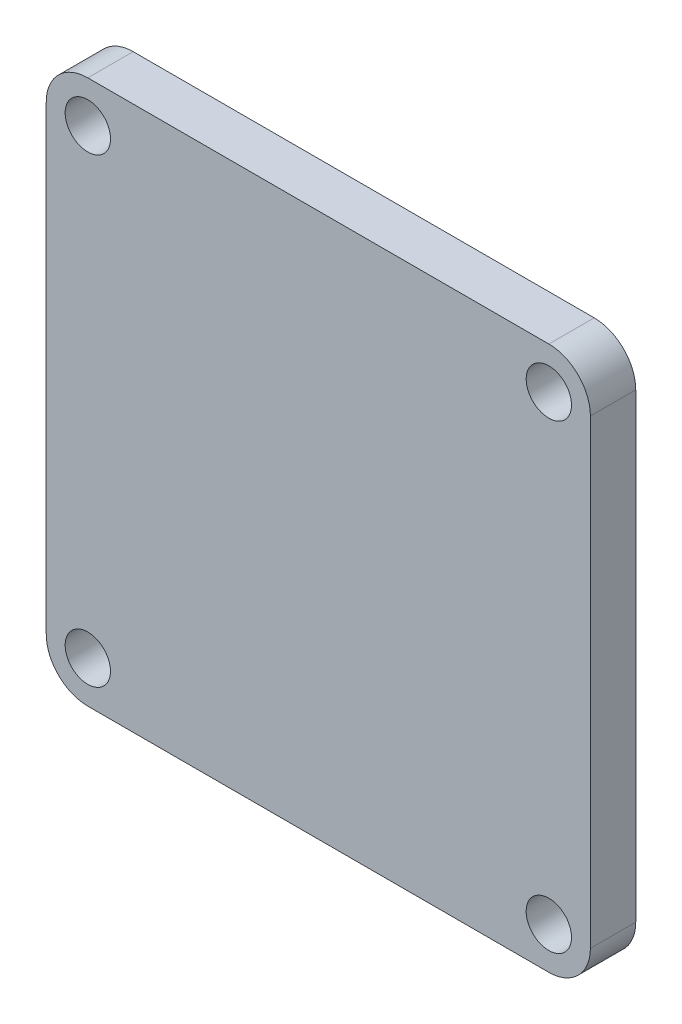
ISO-10303-21;
HEADER;
FILE_DESCRIPTION(('STEP AP214'),'2;1');
FILE_NAME('part.step','',(''),(''),'','','');
FILE_SCHEMA(('AUTOMOTIVE_DESIGN { 1 0 10303 214 1 1 1 1 }'));
ENDSEC;
DATA;
#1=APPLICATION_CONTEXT('core data for automotive mechanical design processes');
#2=APPLICATION_PROTOCOL_DEFINITION('international standard','automotive_design',2000,#1);
#3=PRODUCT_CONTEXT('',#1,'mechanical');
#4=PRODUCT('Part','Part','',(#3));
#5=PRODUCT_RELATED_PRODUCT_CATEGORY('part','',(#4));
#6=PRODUCT_DEFINITION_FORMATION('','',#4);
#7=PRODUCT_DEFINITION_CONTEXT('part definition',#1,'design');
#8=PRODUCT_DEFINITION('design','',#6,#7);
#9=PRODUCT_DEFINITION_SHAPE('','',#8);
#10=(LENGTH_UNIT() NAMED_UNIT(*) SI_UNIT(.MILLI.,.METRE.));
#11=(NAMED_UNIT(*) PLANE_ANGLE_UNIT() SI_UNIT($,.RADIAN.));
#12=(NAMED_UNIT(*) SI_UNIT($,.STERADIAN.) SOLID_ANGLE_UNIT());
#13=UNCERTAINTY_MEASURE_WITH_UNIT(LENGTH_MEASURE(1.E-05),#10,'distance_accuracy_value','');
#14=(GEOMETRIC_REPRESENTATION_CONTEXT(3) GLOBAL_UNCERTAINTY_ASSIGNED_CONTEXT((#13)) GLOBAL_UNIT_ASSIGNED_CONTEXT((#10,
#11,#12)) REPRESENTATION_CONTEXT('',''));
#15=CARTESIAN_POINT('',(0.,0.,0.));
#16=DIRECTION('',(0.,0.,1.));
#17=DIRECTION('',(1.,0.,0.));
#18=AXIS2_PLACEMENT_3D('',#15,#16,#17);
#19=CARTESIAN_POINT('',(-15.25,-15.25,3.));
#20=DIRECTION('',(0.,0.,-1.));
#21=DIRECTION('',(-1.,0.,0.));
#22=AXIS2_PLACEMENT_3D('',#19,#20,#21);
#23=PLANE('',#22);
#24=CARTESIAN_POINT('',(-15.25,-15.25,3.));
#25=DIRECTION('',(0.,0.,1.));
#26=DIRECTION('',(-1.,0.,0.));
#27=AXIS2_PLACEMENT_3D('',#24,#25,#26);
#28=CIRCLE('',#27,2.75);
#29=CARTESIAN_POINT('',(-18.,-15.25,3.));
#30=VERTEX_POINT('',#29);
#31=CARTESIAN_POINT('',(-15.25,-18.,3.));
#32=VERTEX_POINT('',#31);
#33=EDGE_CURVE('E145',#30,#32,#28,.T.);
#34=ORIENTED_EDGE('',*,*,#33,.T.);
#35=DIRECTION('',(1.,0.,0.));
#36=VECTOR('',#35,1.);
#37=CARTESIAN_POINT('',(-15.25,-18.,3.));
#38=LINE('',#37,#36);
#39=CARTESIAN_POINT('',(15.25,-18.,3.));
#40=VERTEX_POINT('',#39);
#41=EDGE_CURVE('E93',#32,#40,#38,.T.);
#42=ORIENTED_EDGE('',*,*,#41,.T.);
#43=CARTESIAN_POINT('',(15.25,-15.25,3.));
#44=DIRECTION('',(0.,0.,1.));
#45=DIRECTION('',(1.,0.,0.));
#46=AXIS2_PLACEMENT_3D('',#43,#44,#45);
#47=CIRCLE('',#46,2.75);
#48=CARTESIAN_POINT('',(18.,-15.25,3.));
#49=VERTEX_POINT('',#48);
#50=EDGE_CURVE('E160',#40,#49,#47,.T.);
#51=ORIENTED_EDGE('',*,*,#50,.T.);
#52=DIRECTION('',(0.,1.,0.));
#53=VECTOR('',#52,1.);
#54=CARTESIAN_POINT('',(18.,15.25,3.));
#55=LINE('',#54,#53);
#56=CARTESIAN_POINT('',(18.,15.25,3.));
#57=VERTEX_POINT('',#56);
#58=EDGE_CURVE('E173',#49,#57,#55,.T.);
#59=ORIENTED_EDGE('',*,*,#58,.T.);
#60=CARTESIAN_POINT('',(15.25,15.25,3.));
#61=DIRECTION('',(0.,0.,1.));
#62=DIRECTION('',(1.,0.,0.));
#63=AXIS2_PLACEMENT_3D('',#60,#61,#62);
#64=CIRCLE('',#63,2.75);
#65=CARTESIAN_POINT('',(15.25,18.,3.));
#66=VERTEX_POINT('',#65);
#67=EDGE_CURVE('E112',#57,#66,#64,.T.);
#68=ORIENTED_EDGE('',*,*,#67,.T.);
#69=DIRECTION('',(-1.,0.,0.));
#70=VECTOR('',#69,1.);
#71=CARTESIAN_POINT('',(-15.25,18.,3.));
#72=LINE('',#71,#70);
#73=CARTESIAN_POINT('',(-15.25,18.,3.));
#74=VERTEX_POINT('',#73);
#75=EDGE_CURVE('E106',#66,#74,#72,.T.);
#76=ORIENTED_EDGE('',*,*,#75,.T.);
#77=CARTESIAN_POINT('',(-15.25,15.25,3.));
#78=DIRECTION('',(0.,0.,1.));
#79=DIRECTION('',(-1.,0.,0.));
#80=AXIS2_PLACEMENT_3D('',#77,#78,#79);
#81=CIRCLE('',#80,2.75);
#82=CARTESIAN_POINT('',(-18.,15.25,3.));
#83=VERTEX_POINT('',#82);
#84=EDGE_CURVE('E110',#74,#83,#81,.T.);
#85=ORIENTED_EDGE('',*,*,#84,.T.);
#86=DIRECTION('',(0.,-1.,0.));
#87=VECTOR('',#86,1.);
#88=CARTESIAN_POINT('',(-18.,15.25,3.));
#89=LINE('',#88,#87);
#90=EDGE_CURVE('E50',#83,#30,#89,.T.);
#91=ORIENTED_EDGE('',*,*,#90,.T.);
#92=EDGE_LOOP('',(#34,#42,#51,#59,#68,#76,#85,#91));
#93=FACE_BOUND('',#92,.T.);
#94=CARTESIAN_POINT('',(-15.25,15.25,3.));
#95=DIRECTION('',(0.,0.,1.));
#96=DIRECTION('',(1.,0.,0.));
#97=AXIS2_PLACEMENT_3D('',#94,#95,#96);
#98=CIRCLE('',#97,1.5);
#99=CARTESIAN_POINT('',(-13.75,15.25,3.));
#100=VERTEX_POINT('',#99);
#101=EDGE_CURVE('E134',#100,#100,#98,.T.);
#102=ORIENTED_EDGE('',*,*,#101,.F.);
#103=EDGE_LOOP('',(#102));
#104=FACE_BOUND('',#103,.T.);
#105=CARTESIAN_POINT('',(15.25,15.25,3.));
#106=DIRECTION('',(0.,0.,1.));
#107=DIRECTION('',(-1.,0.,0.));
#108=AXIS2_PLACEMENT_3D('',#105,#106,#107);
#109=CIRCLE('',#108,1.5);
#110=CARTESIAN_POINT('',(13.75,15.25,3.));
#111=VERTEX_POINT('',#110);
#112=EDGE_CURVE('E182',#111,#111,#109,.T.);
#113=ORIENTED_EDGE('',*,*,#112,.F.);
#114=EDGE_LOOP('',(#113));
#115=FACE_BOUND('',#114,.T.);
#116=CARTESIAN_POINT('',(15.25,-15.25,3.));
#117=DIRECTION('',(0.,0.,1.));
#118=DIRECTION('',(1.,0.,0.));
#119=AXIS2_PLACEMENT_3D('',#116,#117,#118);
#120=CIRCLE('',#119,1.5);
#121=CARTESIAN_POINT('',(16.75,-15.25,3.));
#122=VERTEX_POINT('',#121);
#123=EDGE_CURVE('E188',#122,#122,#120,.T.);
#124=ORIENTED_EDGE('',*,*,#123,.F.);
#125=EDGE_LOOP('',(#124));
#126=FACE_BOUND('',#125,.T.);
#127=CARTESIAN_POINT('',(-15.25,-15.25,3.));
#128=DIRECTION('',(0.,0.,1.));
#129=DIRECTION('',(-1.,0.,0.));
#130=AXIS2_PLACEMENT_3D('',#127,#128,#129);
#131=CIRCLE('',#130,1.5);
#132=CARTESIAN_POINT('',(-16.75,-15.25,3.));
#133=VERTEX_POINT('',#132);
#134=EDGE_CURVE('E194',#133,#133,#131,.T.);
#135=ORIENTED_EDGE('',*,*,#134,.F.);
#136=EDGE_LOOP('',(#135));
#137=FACE_BOUND('',#136,.T.);
#138=ADVANCED_FACE('F33',(#93,#104,#115,#126,#137),#23,.F.);
#139=CARTESIAN_POINT('',(-15.25,-15.25,0.));
#140=DIRECTION('',(0.,0.,-1.));
#141=DIRECTION('',(-1.,0.,0.));
#142=AXIS2_PLACEMENT_3D('',#139,#140,#141);
#143=PLANE('',#142);
#144=CARTESIAN_POINT('',(15.25,-15.25,0.));
#145=DIRECTION('',(0.,0.,1.));
#146=DIRECTION('',(1.,0.,0.));
#147=AXIS2_PLACEMENT_3D('',#144,#145,#146);
#148=CIRCLE('',#147,1.5);
#149=CARTESIAN_POINT('',(16.75,-15.25,0.));
#150=VERTEX_POINT('',#149);
#151=EDGE_CURVE('E191',#150,#150,#148,.T.);
#152=ORIENTED_EDGE('',*,*,#151,.T.);
#153=EDGE_LOOP('',(#152));
#154=FACE_BOUND('',#153,.T.);
#155=CARTESIAN_POINT('',(-15.25,15.25,0.));
#156=DIRECTION('',(0.,0.,1.));
#157=DIRECTION('',(1.,0.,0.));
#158=AXIS2_PLACEMENT_3D('',#155,#156,#157);
#159=CIRCLE('',#158,1.5);
#160=CARTESIAN_POINT('',(-13.75,15.25,0.));
#161=VERTEX_POINT('',#160);
#162=EDGE_CURVE('E179',#161,#161,#159,.T.);
#163=ORIENTED_EDGE('',*,*,#162,.T.);
#164=EDGE_LOOP('',(#163));
#165=FACE_BOUND('',#164,.T.);
#166=CARTESIAN_POINT('',(-15.25,-15.25,0.));
#167=DIRECTION('',(0.,0.,1.));
#168=DIRECTION('',(-1.,0.,0.));
#169=AXIS2_PLACEMENT_3D('',#166,#167,#168);
#170=CIRCLE('',#169,2.75);
#171=CARTESIAN_POINT('',(-18.,-15.25,0.));
#172=VERTEX_POINT('',#171);
#173=CARTESIAN_POINT('',(-15.25,-18.,0.));
#174=VERTEX_POINT('',#173);
#175=EDGE_CURVE('E130',#172,#174,#170,.T.);
#176=ORIENTED_EDGE('',*,*,#175,.F.);
#177=DIRECTION('',(0.,-1.,0.));
#178=VECTOR('',#177,1.);
#179=CARTESIAN_POINT('',(-18.,15.25,0.));
#180=LINE('',#179,#178);
#181=CARTESIAN_POINT('',(-18.,15.25,0.));
#182=VERTEX_POINT('',#181);
#183=EDGE_CURVE('E85',#182,#172,#180,.T.);
#184=ORIENTED_EDGE('',*,*,#183,.F.);
#185=CARTESIAN_POINT('',(-15.25,15.25,0.));
#186=DIRECTION('',(0.,0.,1.));
#187=DIRECTION('',(-1.,0.,0.));
#188=AXIS2_PLACEMENT_3D('',#185,#186,#187);
#189=CIRCLE('',#188,2.75);
#190=CARTESIAN_POINT('',(-15.25,18.,0.));
#191=VERTEX_POINT('',#190);
#192=EDGE_CURVE('E79',#191,#182,#189,.T.);
#193=ORIENTED_EDGE('',*,*,#192,.F.);
#194=DIRECTION('',(-1.,0.,0.));
#195=VECTOR('',#194,1.);
#196=CARTESIAN_POINT('',(-15.25,18.,0.));
#197=LINE('',#196,#195);
#198=CARTESIAN_POINT('',(15.25,18.,0.));
#199=VERTEX_POINT('',#198);
#200=EDGE_CURVE('E120',#199,#191,#197,.T.);
#201=ORIENTED_EDGE('',*,*,#200,.F.);
#202=CARTESIAN_POINT('',(15.25,15.25,0.));
#203=DIRECTION('',(0.,0.,1.));
#204=DIRECTION('',(1.,0.,0.));
#205=AXIS2_PLACEMENT_3D('',#202,#203,#204);
#206=CIRCLE('',#205,2.75);
#207=CARTESIAN_POINT('',(18.,15.25,0.));
#208=VERTEX_POINT('',#207);
#209=EDGE_CURVE('E140',#208,#199,#206,.T.);
#210=ORIENTED_EDGE('',*,*,#209,.F.);
#211=DIRECTION('',(0.,1.,0.));
#212=VECTOR('',#211,1.);
#213=CARTESIAN_POINT('',(18.,15.25,0.));
#214=LINE('',#213,#212);
#215=CARTESIAN_POINT('',(18.,-15.25,0.));
#216=VERTEX_POINT('',#215);
#217=EDGE_CURVE('E138',#216,#208,#214,.T.);
#218=ORIENTED_EDGE('',*,*,#217,.F.);
#219=CARTESIAN_POINT('',(15.25,-15.25,0.));
#220=DIRECTION('',(0.,0.,1.));
#221=DIRECTION('',(1.,0.,0.));
#222=AXIS2_PLACEMENT_3D('',#219,#220,#221);
#223=CIRCLE('',#222,2.75);
#224=CARTESIAN_POINT('',(15.25,-18.,0.));
#225=VERTEX_POINT('',#224);
#226=EDGE_CURVE('E136',#225,#216,#223,.T.);
#227=ORIENTED_EDGE('',*,*,#226,.F.);
#228=DIRECTION('',(1.,0.,0.));
#229=VECTOR('',#228,1.);
#230=CARTESIAN_POINT('',(-15.25,-18.,0.));
#231=LINE('',#230,#229);
#232=EDGE_CURVE('E133',#174,#225,#231,.T.);
#233=ORIENTED_EDGE('',*,*,#232,.F.);
#234=EDGE_LOOP('',(#176,#184,#193,#201,#210,#218,#227,#233));
#235=FACE_BOUND('',#234,.T.);
#236=CARTESIAN_POINT('',(15.25,15.25,0.));
#237=DIRECTION('',(0.,0.,1.));
#238=DIRECTION('',(-1.,0.,0.));
#239=AXIS2_PLACEMENT_3D('',#236,#237,#238);
#240=CIRCLE('',#239,1.5);
#241=CARTESIAN_POINT('',(13.75,15.25,0.));
#242=VERTEX_POINT('',#241);
#243=EDGE_CURVE('E185',#242,#242,#240,.T.);
#244=ORIENTED_EDGE('',*,*,#243,.T.);
#245=EDGE_LOOP('',(#244));
#246=FACE_BOUND('',#245,.T.);
#247=CARTESIAN_POINT('',(-15.25,-15.25,0.));
#248=DIRECTION('',(0.,0.,1.));
#249=DIRECTION('',(-1.,0.,0.));
#250=AXIS2_PLACEMENT_3D('',#247,#248,#249);
#251=CIRCLE('',#250,1.5);
#252=CARTESIAN_POINT('',(-16.75,-15.25,0.));
#253=VERTEX_POINT('',#252);
#254=EDGE_CURVE('E197',#253,#253,#251,.T.);
#255=ORIENTED_EDGE('',*,*,#254,.T.);
#256=EDGE_LOOP('',(#255));
#257=FACE_BOUND('',#256,.T.);
#258=ADVANCED_FACE('F164',(#154,#165,#235,#246,#257),#143,.T.);
#259=CARTESIAN_POINT('',(-15.25,-15.25,3.));
#260=DIRECTION('',(0.,0.,-1.));
#261=DIRECTION('',(-1.,0.,0.));
#262=AXIS2_PLACEMENT_3D('',#259,#260,#261);
#263=CYLINDRICAL_SURFACE('',#262,2.75);
#264=ORIENTED_EDGE('',*,*,#175,.T.);
#265=DIRECTION('',(0.,0.,-1.));
#266=VECTOR('',#265,1.);
#267=CARTESIAN_POINT('',(-15.25,-18.,3.));
#268=LINE('',#267,#266);
#269=EDGE_CURVE('E11',#32,#174,#268,.T.);
#270=ORIENTED_EDGE('',*,*,#269,.F.);
#271=ORIENTED_EDGE('',*,*,#33,.F.);
#272=DIRECTION('',(0.,0.,-1.));
#273=VECTOR('',#272,1.);
#274=CARTESIAN_POINT('',(-18.,-15.25,3.));
#275=LINE('',#274,#273);
#276=EDGE_CURVE('E126',#30,#172,#275,.T.);
#277=ORIENTED_EDGE('',*,*,#276,.T.);
#278=EDGE_LOOP('',(#264,#270,#271,#277));
#279=FACE_BOUND('',#278,.T.);
#280=ADVANCED_FACE('F35',(#279),#263,.T.);
#281=CARTESIAN_POINT('',(-15.25,-18.,3.));
#282=DIRECTION('',(0.,1.,0.));
#283=DIRECTION('',(-1.,0.,0.));
#284=AXIS2_PLACEMENT_3D('',#281,#282,#283);
#285=PLANE('',#284);
#286=ORIENTED_EDGE('',*,*,#232,.T.);
#287=DIRECTION('',(0.,0.,-1.));
#288=VECTOR('',#287,1.);
#289=CARTESIAN_POINT('',(15.25,-18.,3.));
#290=LINE('',#289,#288);
#291=EDGE_CURVE('E42',#40,#225,#290,.T.);
#292=ORIENTED_EDGE('',*,*,#291,.F.);
#293=ORIENTED_EDGE('',*,*,#41,.F.);
#294=ORIENTED_EDGE('',*,*,#269,.T.);
#295=EDGE_LOOP('',(#286,#292,#293,#294));
#296=FACE_BOUND('',#295,.T.);
#297=ADVANCED_FACE('F229',(#296),#285,.F.);
#298=CARTESIAN_POINT('',(15.25,-15.25,3.));
#299=DIRECTION('',(0.,0.,-1.));
#300=DIRECTION('',(-1.,0.,0.));
#301=AXIS2_PLACEMENT_3D('',#298,#299,#300);
#302=CYLINDRICAL_SURFACE('',#301,2.75);
#303=ORIENTED_EDGE('',*,*,#226,.T.);
#304=DIRECTION('',(0.,0.,-1.));
#305=VECTOR('',#304,1.);
#306=CARTESIAN_POINT('',(18.,-15.25,3.));
#307=LINE('',#306,#305);
#308=EDGE_CURVE('E152',#49,#216,#307,.T.);
#309=ORIENTED_EDGE('',*,*,#308,.F.);
#310=ORIENTED_EDGE('',*,*,#50,.F.);
#311=ORIENTED_EDGE('',*,*,#291,.T.);
#312=EDGE_LOOP('',(#303,#309,#310,#311));
#313=FACE_BOUND('',#312,.T.);
#314=ADVANCED_FACE('F158',(#313),#302,.T.);
#315=CARTESIAN_POINT('',(18.,15.25,3.));
#316=DIRECTION('',(-1.,0.,0.));
#317=DIRECTION('',(0.,0.,1.));
#318=AXIS2_PLACEMENT_3D('',#315,#316,#317);
#319=PLANE('',#318);
#320=ORIENTED_EDGE('',*,*,#217,.T.);
#321=DIRECTION('',(0.,0.,-1.));
#322=VECTOR('',#321,1.);
#323=CARTESIAN_POINT('',(18.,15.25,3.));
#324=LINE('',#323,#322);
#325=EDGE_CURVE('E149',#57,#208,#324,.T.);
#326=ORIENTED_EDGE('',*,*,#325,.F.);
#327=ORIENTED_EDGE('',*,*,#58,.F.);
#328=ORIENTED_EDGE('',*,*,#308,.T.);
#329=EDGE_LOOP('',(#320,#326,#327,#328));
#330=FACE_BOUND('',#329,.T.);
#331=ADVANCED_FACE('F169',(#330),#319,.F.);
#332=CARTESIAN_POINT('',(15.25,15.25,3.));
#333=DIRECTION('',(0.,0.,-1.));
#334=DIRECTION('',(-1.,0.,0.));
#335=AXIS2_PLACEMENT_3D('',#332,#333,#334);
#336=CYLINDRICAL_SURFACE('',#335,2.75);
#337=ORIENTED_EDGE('',*,*,#209,.T.);
#338=DIRECTION('',(0.,0.,-1.));
#339=VECTOR('',#338,1.);
#340=CARTESIAN_POINT('',(15.25,18.,3.));
#341=LINE('',#340,#339);
#342=EDGE_CURVE('E121',#66,#199,#341,.T.);
#343=ORIENTED_EDGE('',*,*,#342,.F.);
#344=ORIENTED_EDGE('',*,*,#67,.F.);
#345=ORIENTED_EDGE('',*,*,#325,.T.);
#346=EDGE_LOOP('',(#337,#343,#344,#345));
#347=FACE_BOUND('',#346,.T.);
#348=ADVANCED_FACE('F172',(#347),#336,.T.);
#349=CARTESIAN_POINT('',(-15.25,18.,3.));
#350=DIRECTION('',(0.,-1.,0.));
#351=DIRECTION('',(1.,0.,0.));
#352=AXIS2_PLACEMENT_3D('',#349,#350,#351);
#353=PLANE('',#352);
#354=ORIENTED_EDGE('',*,*,#200,.T.);
#355=DIRECTION('',(0.,0.,-1.));
#356=VECTOR('',#355,1.);
#357=CARTESIAN_POINT('',(-15.25,18.,3.));
#358=LINE('',#357,#356);
#359=EDGE_CURVE('E117',#74,#191,#358,.T.);
#360=ORIENTED_EDGE('',*,*,#359,.F.);
#361=ORIENTED_EDGE('',*,*,#75,.F.);
#362=ORIENTED_EDGE('',*,*,#342,.T.);
#363=EDGE_LOOP('',(#354,#360,#361,#362));
#364=FACE_BOUND('',#363,.T.);
#365=ADVANCED_FACE('F118',(#364),#353,.F.);
#366=CARTESIAN_POINT('',(-15.25,15.25,3.));
#367=DIRECTION('',(0.,0.,-1.));
#368=DIRECTION('',(-1.,0.,0.));
#369=AXIS2_PLACEMENT_3D('',#366,#367,#368);
#370=CYLINDRICAL_SURFACE('',#369,2.75);
#371=ORIENTED_EDGE('',*,*,#192,.T.);
#372=DIRECTION('',(0.,0.,-1.));
#373=VECTOR('',#372,1.);
#374=CARTESIAN_POINT('',(-18.,15.25,3.));
#375=LINE('',#374,#373);
#376=EDGE_CURVE('E122',#83,#182,#375,.T.);
#377=ORIENTED_EDGE('',*,*,#376,.F.);
#378=ORIENTED_EDGE('',*,*,#84,.F.);
#379=ORIENTED_EDGE('',*,*,#359,.T.);
#380=EDGE_LOOP('',(#371,#377,#378,#379));
#381=FACE_BOUND('',#380,.T.);
#382=ADVANCED_FACE('F124',(#381),#370,.T.);
#383=CARTESIAN_POINT('',(-18.,15.25,3.));
#384=DIRECTION('',(1.,0.,0.));
#385=DIRECTION('',(0.,1.,0.));
#386=AXIS2_PLACEMENT_3D('',#383,#384,#385);
#387=PLANE('',#386);
#388=ORIENTED_EDGE('',*,*,#183,.T.);
#389=ORIENTED_EDGE('',*,*,#276,.F.);
#390=ORIENTED_EDGE('',*,*,#90,.F.);
#391=ORIENTED_EDGE('',*,*,#376,.T.);
#392=EDGE_LOOP('',(#388,#389,#390,#391));
#393=FACE_BOUND('',#392,.T.);
#394=ADVANCED_FACE('F217',(#393),#387,.F.);
#395=CARTESIAN_POINT('',(-15.25,15.25,3.));
#396=DIRECTION('',(0.,0.,-1.));
#397=DIRECTION('',(-1.,0.,0.));
#398=AXIS2_PLACEMENT_3D('',#395,#396,#397);
#399=CYLINDRICAL_SURFACE('',#398,1.5);
#400=ORIENTED_EDGE('',*,*,#101,.T.);
#401=EDGE_LOOP('',(#400));
#402=FACE_BOUND('',#401,.T.);
#403=ORIENTED_EDGE('',*,*,#162,.F.);
#404=EDGE_LOOP('',(#403));
#405=FACE_BOUND('',#404,.T.);
#406=ADVANCED_FACE('F214',(#402,#405),#399,.F.);
#407=CARTESIAN_POINT('',(15.25,15.25,3.));
#408=DIRECTION('',(0.,0.,-1.));
#409=DIRECTION('',(-1.,0.,0.));
#410=AXIS2_PLACEMENT_3D('',#407,#408,#409);
#411=CYLINDRICAL_SURFACE('',#410,1.5);
#412=ORIENTED_EDGE('',*,*,#112,.T.);
#413=EDGE_LOOP('',(#412));
#414=FACE_BOUND('',#413,.T.);
#415=ORIENTED_EDGE('',*,*,#243,.F.);
#416=EDGE_LOOP('',(#415));
#417=FACE_BOUND('',#416,.T.);
#418=ADVANCED_FACE('F293',(#414,#417),#411,.F.);
#419=CARTESIAN_POINT('',(15.25,-15.25,3.));
#420=DIRECTION('',(0.,0.,-1.));
#421=DIRECTION('',(-1.,0.,0.));
#422=AXIS2_PLACEMENT_3D('',#419,#420,#421);
#423=CYLINDRICAL_SURFACE('',#422,1.5);
#424=ORIENTED_EDGE('',*,*,#123,.T.);
#425=EDGE_LOOP('',(#424));
#426=FACE_BOUND('',#425,.T.);
#427=ORIENTED_EDGE('',*,*,#151,.F.);
#428=EDGE_LOOP('',(#427));
#429=FACE_BOUND('',#428,.T.);
#430=ADVANCED_FACE('F301',(#426,#429),#423,.F.);
#431=CARTESIAN_POINT('',(-15.25,-15.25,3.));
#432=DIRECTION('',(0.,0.,-1.));
#433=DIRECTION('',(-1.,0.,0.));
#434=AXIS2_PLACEMENT_3D('',#431,#432,#433);
#435=CYLINDRICAL_SURFACE('',#434,1.5);
#436=ORIENTED_EDGE('',*,*,#134,.T.);
#437=EDGE_LOOP('',(#436));
#438=FACE_BOUND('',#437,.T.);
#439=ORIENTED_EDGE('',*,*,#254,.F.);
#440=EDGE_LOOP('',(#439));
#441=FACE_BOUND('',#440,.T.);
#442=ADVANCED_FACE('F203',(#438,#441),#435,.F.);
#443=CLOSED_SHELL('',(#138,#258,#280,#297,#314,#331,#348,#365,#382,#394,#406,#418,#430,#442));
#444=MANIFOLD_SOLID_BREP('B2',#443);
#445=ADVANCED_BREP_SHAPE_REPRESENTATION('',(#18,#444),#14);
#446=SHAPE_DEFINITION_REPRESENTATION(#9,#445);
ENDSEC;
END-ISO-10303-21;
